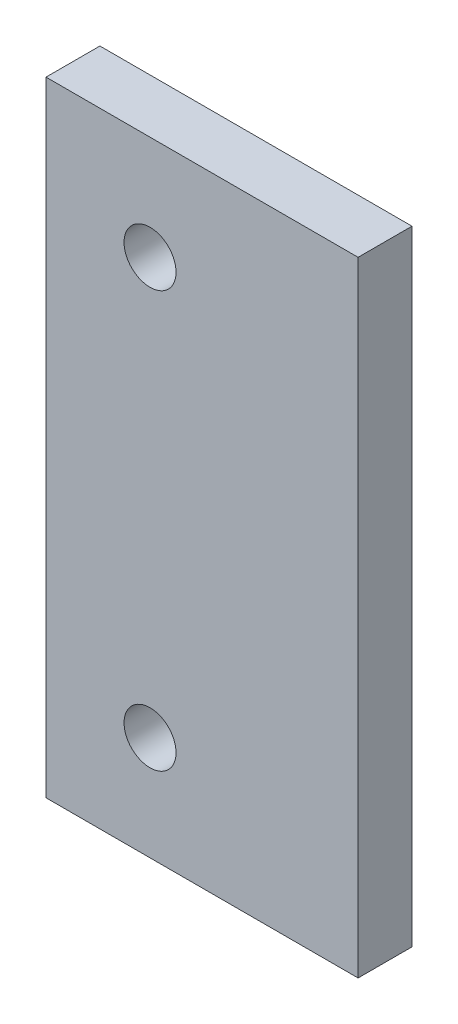
ISO-10303-21;
HEADER;
FILE_DESCRIPTION(('STEP AP214'),'2;1');
FILE_NAME('part.step','',(''),(''),'','','');
FILE_SCHEMA(('AUTOMOTIVE_DESIGN { 1 0 10303 214 1 1 1 1 }'));
ENDSEC;
DATA;
#1=APPLICATION_CONTEXT('core data for automotive mechanical design processes');
#2=APPLICATION_PROTOCOL_DEFINITION('international standard','automotive_design',2000,#1);
#3=PRODUCT_CONTEXT('',#1,'mechanical');
#4=PRODUCT('Part','Part','',(#3));
#5=PRODUCT_RELATED_PRODUCT_CATEGORY('part','',(#4));
#6=PRODUCT_DEFINITION_FORMATION('','',#4);
#7=PRODUCT_DEFINITION_CONTEXT('part definition',#1,'design');
#8=PRODUCT_DEFINITION('design','',#6,#7);
#9=PRODUCT_DEFINITION_SHAPE('','',#8);
#10=(LENGTH_UNIT() NAMED_UNIT(*) SI_UNIT(.MILLI.,.METRE.));
#11=(NAMED_UNIT(*) PLANE_ANGLE_UNIT() SI_UNIT($,.RADIAN.));
#12=(NAMED_UNIT(*) SI_UNIT($,.STERADIAN.) SOLID_ANGLE_UNIT());
#13=UNCERTAINTY_MEASURE_WITH_UNIT(LENGTH_MEASURE(1.E-05),#10,'distance_accuracy_value','');
#14=(GEOMETRIC_REPRESENTATION_CONTEXT(3) GLOBAL_UNCERTAINTY_ASSIGNED_CONTEXT((#13)) GLOBAL_UNIT_ASSIGNED_CONTEXT((#10,
#11,#12)) REPRESENTATION_CONTEXT('',''));
#15=CARTESIAN_POINT('',(0.,0.,0.));
#16=DIRECTION('',(0.,0.,1.));
#17=DIRECTION('',(1.,0.,0.));
#18=AXIS2_PLACEMENT_3D('',#15,#16,#17);
#19=CARTESIAN_POINT('',(19.05,-38.1,6.5786));
#20=DIRECTION('',(-1.,0.,0.));
#21=DIRECTION('',(0.,0.,1.));
#22=AXIS2_PLACEMENT_3D('',#19,#20,#21);
#23=PLANE('',#22);
#24=DIRECTION('',(0.,1.,0.));
#25=VECTOR('',#24,1.);
#26=CARTESIAN_POINT('',(19.05,-38.1,0.));
#27=LINE('',#26,#25);
#28=CARTESIAN_POINT('',(19.05,-38.1,0.));
#29=VERTEX_POINT('',#28);
#30=CARTESIAN_POINT('',(19.05,38.1,0.));
#31=VERTEX_POINT('',#30);
#32=EDGE_CURVE('E104',#29,#31,#27,.T.);
#33=ORIENTED_EDGE('',*,*,#32,.T.);
#34=DIRECTION('',(0.,0.,-1.));
#35=VECTOR('',#34,1.);
#36=CARTESIAN_POINT('',(19.05,38.1,6.5786));
#37=LINE('',#36,#35);
#38=CARTESIAN_POINT('',(19.05,38.1,6.5786));
#39=VERTEX_POINT('',#38);
#40=EDGE_CURVE('E11',#39,#31,#37,.T.);
#41=ORIENTED_EDGE('',*,*,#40,.F.);
#42=DIRECTION('',(0.,1.,0.));
#43=VECTOR('',#42,1.);
#44=CARTESIAN_POINT('',(19.05,-38.1,6.5786));
#45=LINE('',#44,#43);
#46=CARTESIAN_POINT('',(19.05,-38.1,6.5786));
#47=VERTEX_POINT('',#46);
#48=EDGE_CURVE('E92',#47,#39,#45,.T.);
#49=ORIENTED_EDGE('',*,*,#48,.F.);
#50=DIRECTION('',(0.,0.,-1.));
#51=VECTOR('',#50,1.);
#52=CARTESIAN_POINT('',(19.05,-38.1,6.5786));
#53=LINE('',#52,#51);
#54=EDGE_CURVE('E100',#47,#29,#53,.T.);
#55=ORIENTED_EDGE('',*,*,#54,.T.);
#56=EDGE_LOOP('',(#33,#41,#49,#55));
#57=FACE_BOUND('',#56,.T.);
#58=ADVANCED_FACE('F40',(#57),#23,.F.);
#59=CARTESIAN_POINT('',(-19.05,38.1,6.5786));
#60=DIRECTION('',(0.,-1.,0.));
#61=DIRECTION('',(0.,0.,-1.));
#62=AXIS2_PLACEMENT_3D('',#59,#60,#61);
#63=PLANE('',#62);
#64=DIRECTION('',(-1.,0.,0.));
#65=VECTOR('',#64,1.);
#66=CARTESIAN_POINT('',(-19.05,38.1,0.));
#67=LINE('',#66,#65);
#68=CARTESIAN_POINT('',(-19.05,38.1,0.));
#69=VERTEX_POINT('',#68);
#70=EDGE_CURVE('E96',#31,#69,#67,.T.);
#71=ORIENTED_EDGE('',*,*,#70,.T.);
#72=DIRECTION('',(0.,0.,-1.));
#73=VECTOR('',#72,1.);
#74=CARTESIAN_POINT('',(-19.05,38.1,6.5786));
#75=LINE('',#74,#73);
#76=CARTESIAN_POINT('',(-19.05,38.1,6.5786));
#77=VERTEX_POINT('',#76);
#78=EDGE_CURVE('E48',#77,#69,#75,.T.);
#79=ORIENTED_EDGE('',*,*,#78,.F.);
#80=DIRECTION('',(-1.,0.,0.));
#81=VECTOR('',#80,1.);
#82=CARTESIAN_POINT('',(-19.05,38.1,6.5786));
#83=LINE('',#82,#81);
#84=EDGE_CURVE('E86',#39,#77,#83,.T.);
#85=ORIENTED_EDGE('',*,*,#84,.F.);
#86=ORIENTED_EDGE('',*,*,#40,.T.);
#87=EDGE_LOOP('',(#71,#79,#85,#86));
#88=FACE_BOUND('',#87,.T.);
#89=ADVANCED_FACE('F95',(#88),#63,.F.);
#90=CARTESIAN_POINT('',(-19.05,-38.1,6.5786));
#91=DIRECTION('',(1.,0.,0.));
#92=DIRECTION('',(0.,0.,-1.));
#93=AXIS2_PLACEMENT_3D('',#90,#91,#92);
#94=PLANE('',#93);
#95=DIRECTION('',(0.,-1.,0.));
#96=VECTOR('',#95,1.);
#97=CARTESIAN_POINT('',(-19.05,-38.1,0.));
#98=LINE('',#97,#96);
#99=CARTESIAN_POINT('',(-19.05,-38.1,0.));
#100=VERTEX_POINT('',#99);
#101=EDGE_CURVE('E73',#69,#100,#98,.T.);
#102=ORIENTED_EDGE('',*,*,#101,.T.);
#103=DIRECTION('',(0.,0.,-1.));
#104=VECTOR('',#103,1.);
#105=CARTESIAN_POINT('',(-19.05,-38.1,6.5786));
#106=LINE('',#105,#104);
#107=CARTESIAN_POINT('',(-19.05,-38.1,6.5786));
#108=VERTEX_POINT('',#107);
#109=EDGE_CURVE('E97',#108,#100,#106,.T.);
#110=ORIENTED_EDGE('',*,*,#109,.F.);
#111=DIRECTION('',(0.,-1.,0.));
#112=VECTOR('',#111,1.);
#113=CARTESIAN_POINT('',(-19.05,-38.1,6.5786));
#114=LINE('',#113,#112);
#115=EDGE_CURVE('E90',#77,#108,#114,.T.);
#116=ORIENTED_EDGE('',*,*,#115,.F.);
#117=ORIENTED_EDGE('',*,*,#78,.T.);
#118=EDGE_LOOP('',(#102,#110,#116,#117));
#119=FACE_BOUND('',#118,.T.);
#120=ADVANCED_FACE('F98',(#119),#94,.F.);
#121=CARTESIAN_POINT('',(-19.05,-38.1,6.5786));
#122=DIRECTION('',(0.,1.,0.));
#123=DIRECTION('',(0.,0.,1.));
#124=AXIS2_PLACEMENT_3D('',#121,#122,#123);
#125=PLANE('',#124);
#126=DIRECTION('',(1.,0.,0.));
#127=VECTOR('',#126,1.);
#128=CARTESIAN_POINT('',(-19.05,-38.1,0.));
#129=LINE('',#128,#127);
#130=EDGE_CURVE('E79',#100,#29,#129,.T.);
#131=ORIENTED_EDGE('',*,*,#130,.T.);
#132=ORIENTED_EDGE('',*,*,#54,.F.);
#133=DIRECTION('',(1.,0.,0.));
#134=VECTOR('',#133,1.);
#135=CARTESIAN_POINT('',(-19.05,-38.1,6.5786));
#136=LINE('',#135,#134);
#137=EDGE_CURVE('E56',#108,#47,#136,.T.);
#138=ORIENTED_EDGE('',*,*,#137,.F.);
#139=ORIENTED_EDGE('',*,*,#109,.T.);
#140=EDGE_LOOP('',(#131,#132,#138,#139));
#141=FACE_BOUND('',#140,.T.);
#142=ADVANCED_FACE('F112',(#141),#125,.F.);
#143=CARTESIAN_POINT('',(0.,0.,6.5786));
#144=DIRECTION('',(0.,0.,-1.));
#145=DIRECTION('',(-1.,0.,0.));
#146=AXIS2_PLACEMENT_3D('',#143,#144,#145);
#147=PLANE('',#146);
#148=CARTESIAN_POINT('',(-6.35,25.4,6.5786));
#149=DIRECTION('',(0.,0.,1.));
#150=DIRECTION('',(1.,0.,0.));
#151=AXIS2_PLACEMENT_3D('',#148,#149,#150);
#152=CIRCLE('',#151,3.17499999999999);
#153=CARTESIAN_POINT('',(-3.17500000000001,25.4,6.5786));
#154=VERTEX_POINT('',#153);
#155=EDGE_CURVE('E126',#154,#154,#152,.T.);
#156=ORIENTED_EDGE('',*,*,#155,.F.);
#157=EDGE_LOOP('',(#156));
#158=FACE_BOUND('',#157,.T.);
#159=CARTESIAN_POINT('',(-6.35,-25.4,6.5786));
#160=DIRECTION('',(0.,0.,1.));
#161=DIRECTION('',(1.,0.,0.));
#162=AXIS2_PLACEMENT_3D('',#159,#160,#161);
#163=CIRCLE('',#162,3.17499999999999);
#164=CARTESIAN_POINT('',(-3.17500000000001,-25.4,6.5786));
#165=VERTEX_POINT('',#164);
#166=EDGE_CURVE('E120',#165,#165,#163,.T.);
#167=ORIENTED_EDGE('',*,*,#166,.F.);
#168=EDGE_LOOP('',(#167));
#169=FACE_BOUND('',#168,.T.);
#170=ORIENTED_EDGE('',*,*,#48,.T.);
#171=ORIENTED_EDGE('',*,*,#84,.T.);
#172=ORIENTED_EDGE('',*,*,#115,.T.);
#173=ORIENTED_EDGE('',*,*,#137,.T.);
#174=EDGE_LOOP('',(#170,#171,#172,#173));
#175=FACE_BOUND('',#174,.T.);
#176=ADVANCED_FACE('F88',(#158,#169,#175),#147,.F.);
#177=CARTESIAN_POINT('',(0.,0.,0.));
#178=DIRECTION('',(0.,0.,-1.));
#179=DIRECTION('',(-1.,0.,0.));
#180=AXIS2_PLACEMENT_3D('',#177,#178,#179);
#181=PLANE('',#180);
#182=CARTESIAN_POINT('',(-6.35,25.4,0.));
#183=DIRECTION('',(0.,0.,1.));
#184=DIRECTION('',(1.,0.,0.));
#185=AXIS2_PLACEMENT_3D('',#182,#183,#184);
#186=CIRCLE('',#185,3.175);
#187=CARTESIAN_POINT('',(-3.175,25.4,0.));
#188=VERTEX_POINT('',#187);
#189=EDGE_CURVE('E123',#188,#188,#186,.T.);
#190=ORIENTED_EDGE('',*,*,#189,.T.);
#191=EDGE_LOOP('',(#190));
#192=FACE_BOUND('',#191,.T.);
#193=CARTESIAN_POINT('',(-6.35,-25.4,0.));
#194=DIRECTION('',(0.,0.,1.));
#195=DIRECTION('',(1.,0.,0.));
#196=AXIS2_PLACEMENT_3D('',#193,#194,#195);
#197=CIRCLE('',#196,3.175);
#198=CARTESIAN_POINT('',(-3.175,-25.4,0.));
#199=VERTEX_POINT('',#198);
#200=EDGE_CURVE('E107',#199,#199,#197,.T.);
#201=ORIENTED_EDGE('',*,*,#200,.T.);
#202=EDGE_LOOP('',(#201));
#203=FACE_BOUND('',#202,.T.);
#204=ORIENTED_EDGE('',*,*,#32,.F.);
#205=ORIENTED_EDGE('',*,*,#130,.F.);
#206=ORIENTED_EDGE('',*,*,#101,.F.);
#207=ORIENTED_EDGE('',*,*,#70,.F.);
#208=EDGE_LOOP('',(#204,#205,#206,#207));
#209=FACE_BOUND('',#208,.T.);
#210=ADVANCED_FACE('F115',(#192,#203,#209),#181,.T.);
#211=CARTESIAN_POINT('',(-6.35,-25.4,6.5786));
#212=DIRECTION('',(0.,0.,1.));
#213=DIRECTION('',(1.,0.,0.));
#214=AXIS2_PLACEMENT_3D('',#211,#212,#213);
#215=CYLINDRICAL_SURFACE('',#214,3.17499999999999);
#216=ORIENTED_EDGE('',*,*,#200,.F.);
#217=EDGE_LOOP('',(#216));
#218=FACE_BOUND('',#217,.T.);
#219=ORIENTED_EDGE('',*,*,#166,.T.);
#220=EDGE_LOOP('',(#219));
#221=FACE_BOUND('',#220,.T.);
#222=ADVANCED_FACE('F137',(#218,#221),#215,.F.);
#223=CARTESIAN_POINT('',(-6.35,25.4,6.5786));
#224=DIRECTION('',(0.,0.,1.));
#225=DIRECTION('',(1.,0.,0.));
#226=AXIS2_PLACEMENT_3D('',#223,#224,#225);
#227=CYLINDRICAL_SURFACE('',#226,3.17499999999999);
#228=ORIENTED_EDGE('',*,*,#189,.F.);
#229=EDGE_LOOP('',(#228));
#230=FACE_BOUND('',#229,.T.);
#231=ORIENTED_EDGE('',*,*,#155,.T.);
#232=EDGE_LOOP('',(#231));
#233=FACE_BOUND('',#232,.T.);
#234=ADVANCED_FACE('F130',(#230,#233),#227,.F.);
#235=CLOSED_SHELL('',(#58,#89,#120,#142,#176,#210,#222,#234));
#236=MANIFOLD_SOLID_BREP('B2',#235);
#237=ADVANCED_BREP_SHAPE_REPRESENTATION('',(#18,#236),#14);
#238=SHAPE_DEFINITION_REPRESENTATION(#9,#237);
ENDSEC;
END-ISO-10303-21;
